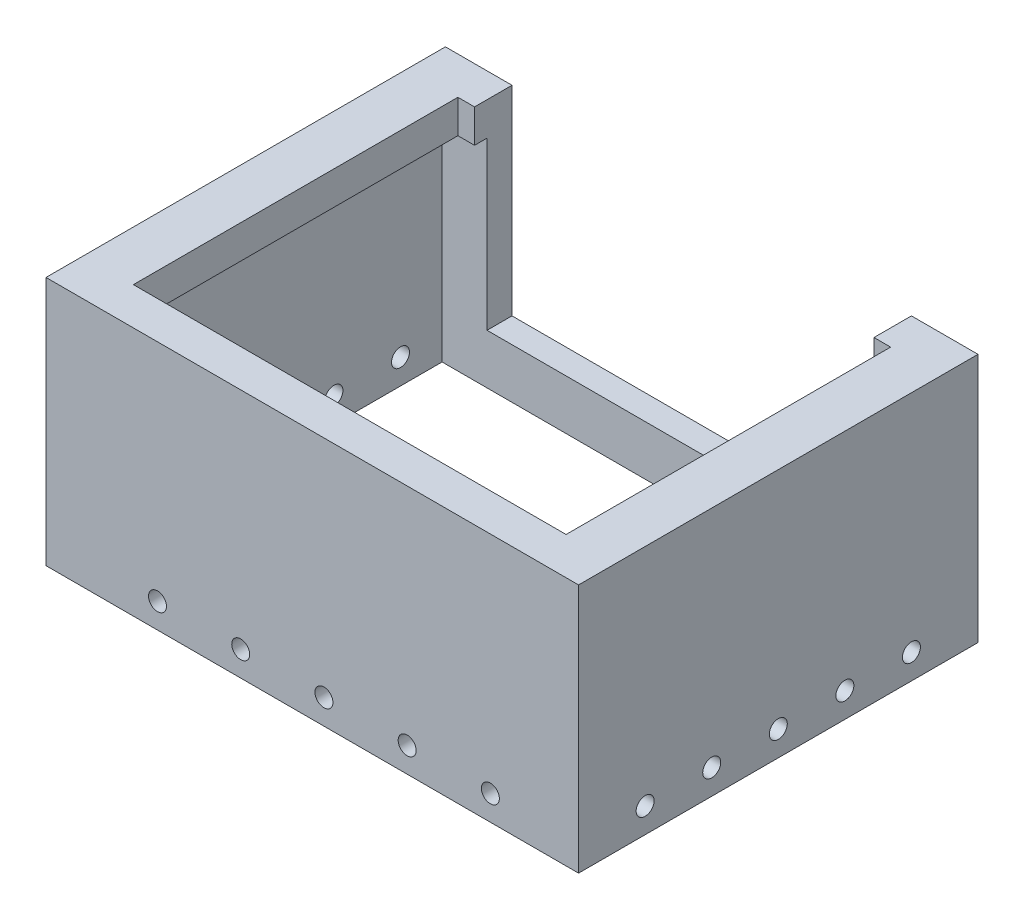
ISO-10303-21;
HEADER;
FILE_DESCRIPTION(('STEP AP214'),'2;1');
FILE_NAME('part.step','',(''),(''),'','','');
FILE_SCHEMA(('AUTOMOTIVE_DESIGN { 1 0 10303 214 1 1 1 1 }'));
ENDSEC;
DATA;
#1=APPLICATION_CONTEXT('core data for automotive mechanical design processes');
#2=APPLICATION_PROTOCOL_DEFINITION('international standard','automotive_design',2000,#1);
#3=PRODUCT_CONTEXT('',#1,'mechanical');
#4=PRODUCT('Part','Part','',(#3));
#5=PRODUCT_RELATED_PRODUCT_CATEGORY('part','',(#4));
#6=PRODUCT_DEFINITION_FORMATION('','',#4);
#7=PRODUCT_DEFINITION_CONTEXT('part definition',#1,'design');
#8=PRODUCT_DEFINITION('design','',#6,#7);
#9=PRODUCT_DEFINITION_SHAPE('','',#8);
#10=(LENGTH_UNIT() NAMED_UNIT(*) SI_UNIT(.MILLI.,.METRE.));
#11=(NAMED_UNIT(*) PLANE_ANGLE_UNIT() SI_UNIT($,.RADIAN.));
#12=(NAMED_UNIT(*) SI_UNIT($,.STERADIAN.) SOLID_ANGLE_UNIT());
#13=UNCERTAINTY_MEASURE_WITH_UNIT(LENGTH_MEASURE(1.E-05),#10,'distance_accuracy_value','');
#14=(GEOMETRIC_REPRESENTATION_CONTEXT(3) GLOBAL_UNCERTAINTY_ASSIGNED_CONTEXT((#13)) GLOBAL_UNIT_ASSIGNED_CONTEXT((#10,
#11,#12)) REPRESENTATION_CONTEXT('',''));
#15=CARTESIAN_POINT('',(0.,0.,0.));
#16=DIRECTION('',(0.,0.,1.));
#17=DIRECTION('',(1.,0.,0.));
#18=AXIS2_PLACEMENT_3D('',#15,#16,#17);
#19=CARTESIAN_POINT('',(-22.4999999999998,10.,-141.171435272045));
#20=DIRECTION('',(1.,0.,0.));
#21=DIRECTION('',(0.,0.,-1.));
#22=AXIS2_PLACEMENT_3D('',#19,#20,#21);
#23=PLANE('',#22);
#24=DIRECTION('',(0.,0.,-1.));
#25=VECTOR('',#24,1.);
#26=CARTESIAN_POINT('',(-22.4999999999998,-50.,-144.921435272045));
#27=LINE('',#26,#25);
#28=CARTESIAN_POINT('',(-22.4999999999998,-50.,-144.921435272045));
#29=VERTEX_POINT('',#28);
#30=CARTESIAN_POINT('',(-22.4999999999998,-50.,-152.421435272045));
#31=VERTEX_POINT('',#30);
#32=EDGE_CURVE('E169',#29,#31,#27,.T.);
#33=ORIENTED_EDGE('',*,*,#32,.F.);
#34=DIRECTION('',(0.,1.,0.));
#35=VECTOR('',#34,1.);
#36=CARTESIAN_POINT('',(-22.4999999999998,-65.,-144.921435272045));
#37=LINE('',#36,#35);
#38=CARTESIAN_POINT('',(-22.4999999999998,0.,-144.921435272045));
#39=VERTEX_POINT('',#38);
#40=EDGE_CURVE('E176',#29,#39,#37,.T.);
#41=ORIENTED_EDGE('',*,*,#40,.T.);
#42=DIRECTION('',(0.,0.,1.));
#43=VECTOR('',#42,1.);
#44=CARTESIAN_POINT('',(-22.4999999999998,0.,-141.171435272045));
#45=LINE('',#44,#43);
#46=CARTESIAN_POINT('',(-22.4999999999998,0.,-141.171435272045));
#47=VERTEX_POINT('',#46);
#48=EDGE_CURVE('E188',#39,#47,#45,.T.);
#49=ORIENTED_EDGE('',*,*,#48,.T.);
#50=DIRECTION('',(0.,-1.,0.));
#51=VECTOR('',#50,1.);
#52=CARTESIAN_POINT('',(-22.4999999999998,10.,-141.171435272045));
#53=LINE('',#52,#51);
#54=CARTESIAN_POINT('',(-22.4999999999998,10.,-141.171435272045));
#55=VERTEX_POINT('',#54);
#56=EDGE_CURVE('E257',#55,#47,#53,.T.);
#57=ORIENTED_EDGE('',*,*,#56,.F.);
#58=DIRECTION('',(0.,0.,1.));
#59=VECTOR('',#58,1.);
#60=CARTESIAN_POINT('',(-22.4999999999998,10.,-141.171435272045));
#61=LINE('',#60,#59);
#62=CARTESIAN_POINT('',(-22.4999999999998,10.,-152.421435272045));
#63=VERTEX_POINT('',#62);
#64=EDGE_CURVE('E200',#63,#55,#61,.T.);
#65=ORIENTED_EDGE('',*,*,#64,.F.);
#66=DIRECTION('',(0.,-1.,0.));
#67=VECTOR('',#66,1.);
#68=CARTESIAN_POINT('',(-22.4999999999998,10.,-152.421435272045));
#69=LINE('',#68,#67);
#70=EDGE_CURVE('E46',#63,#31,#69,.T.);
#71=ORIENTED_EDGE('',*,*,#70,.T.);
#72=EDGE_LOOP('',(#33,#41,#49,#57,#65,#71));
#73=FACE_BOUND('',#72,.T.);
#74=ADVANCED_FACE('F37',(#73),#23,.F.);
#75=CARTESIAN_POINT('',(-142.5,10.,-141.171435272045));
#76=DIRECTION('',(-1.,0.,0.));
#77=DIRECTION('',(0.,0.,1.));
#78=AXIS2_PLACEMENT_3D('',#75,#76,#77);
#79=PLANE('',#78);
#80=DIRECTION('',(0.,0.,1.));
#81=VECTOR('',#80,1.);
#82=CARTESIAN_POINT('',(-142.5,-50.,-141.171435272045));
#83=LINE('',#82,#81);
#84=CARTESIAN_POINT('',(-142.5,-50.,-152.421435272045));
#85=VERTEX_POINT('',#84);
#86=CARTESIAN_POINT('',(-142.5,-50.,-144.921435272045));
#87=VERTEX_POINT('',#86);
#88=EDGE_CURVE('E54',#85,#87,#83,.T.);
#89=ORIENTED_EDGE('',*,*,#88,.F.);
#90=DIRECTION('',(0.,-1.,0.));
#91=VECTOR('',#90,1.);
#92=CARTESIAN_POINT('',(-142.5,10.,-152.421435272045));
#93=LINE('',#92,#91);
#94=CARTESIAN_POINT('',(-142.5,10.,-152.421435272045));
#95=VERTEX_POINT('',#94);
#96=EDGE_CURVE('E240',#95,#85,#93,.T.);
#97=ORIENTED_EDGE('',*,*,#96,.F.);
#98=DIRECTION('',(0.,0.,-1.));
#99=VECTOR('',#98,1.);
#100=CARTESIAN_POINT('',(-142.5,10.,-141.171435272045));
#101=LINE('',#100,#99);
#102=CARTESIAN_POINT('',(-142.5,10.,-141.171435272045));
#103=VERTEX_POINT('',#102);
#104=EDGE_CURVE('E212',#103,#95,#101,.T.);
#105=ORIENTED_EDGE('',*,*,#104,.F.);
#106=DIRECTION('',(0.,-1.,0.));
#107=VECTOR('',#106,1.);
#108=CARTESIAN_POINT('',(-142.5,10.,-141.171435272045));
#109=LINE('',#108,#107);
#110=CARTESIAN_POINT('',(-142.5,0.,-141.171435272045));
#111=VERTEX_POINT('',#110);
#112=EDGE_CURVE('E242',#103,#111,#109,.T.);
#113=ORIENTED_EDGE('',*,*,#112,.T.);
#114=DIRECTION('',(0.,0.,-1.));
#115=VECTOR('',#114,1.);
#116=CARTESIAN_POINT('',(-142.5,0.,-141.171435272045));
#117=LINE('',#116,#115);
#118=CARTESIAN_POINT('',(-142.5,0.,-144.921435272045));
#119=VERTEX_POINT('',#118);
#120=EDGE_CURVE('E198',#111,#119,#117,.T.);
#121=ORIENTED_EDGE('',*,*,#120,.T.);
#122=DIRECTION('',(0.,1.,0.));
#123=VECTOR('',#122,1.);
#124=CARTESIAN_POINT('',(-142.5,-65.,-144.921435272045));
#125=LINE('',#124,#123);
#126=EDGE_CURVE('E186',#87,#119,#125,.T.);
#127=ORIENTED_EDGE('',*,*,#126,.F.);
#128=EDGE_LOOP('',(#89,#97,#105,#113,#121,#127));
#129=FACE_BOUND('',#128,.T.);
#130=ADVANCED_FACE('F335',(#129),#79,.F.);
#131=CARTESIAN_POINT('',(0.,0.,0.));
#132=DIRECTION('',(0.,1.,0.));
#133=DIRECTION('',(0.,0.,1.));
#134=AXIS2_PLACEMENT_3D('',#131,#132,#133);
#135=PLANE('',#134);
#136=DIRECTION('',(-1.,0.,0.));
#137=VECTOR('',#136,1.);
#138=CARTESIAN_POINT('',(-142.5,0.,-144.921435272045));
#139=LINE('',#138,#137);
#140=CARTESIAN_POINT('',(-156.,0.,-144.921435272045));
#141=VERTEX_POINT('',#140);
#142=EDGE_CURVE('E317',#119,#141,#139,.T.);
#143=ORIENTED_EDGE('',*,*,#142,.F.);
#144=ORIENTED_EDGE('',*,*,#120,.F.);
#145=DIRECTION('',(1.,0.,0.));
#146=VECTOR('',#145,1.);
#147=CARTESIAN_POINT('',(-147.5,0.,-141.171435272045));
#148=LINE('',#147,#146);
#149=CARTESIAN_POINT('',(-147.5,0.,-141.171435272045));
#150=VERTEX_POINT('',#149);
#151=EDGE_CURVE('E230',#150,#111,#148,.T.);
#152=ORIENTED_EDGE('',*,*,#151,.F.);
#153=DIRECTION('',(0.,0.,-1.));
#154=VECTOR('',#153,1.);
#155=CARTESIAN_POINT('',(-147.5,0.,-43.671435272045));
#156=LINE('',#155,#154);
#157=CARTESIAN_POINT('',(-147.5,0.,-43.671435272045));
#158=VERTEX_POINT('',#157);
#159=EDGE_CURVE('E228',#158,#150,#156,.T.);
#160=ORIENTED_EDGE('',*,*,#159,.F.);
#161=DIRECTION('',(-1.,0.,0.));
#162=VECTOR('',#161,1.);
#163=CARTESIAN_POINT('',(-17.4999999999999,0.,-43.671435272045));
#164=LINE('',#163,#162);
#165=CARTESIAN_POINT('',(-17.4999999999999,0.,-43.671435272045));
#166=VERTEX_POINT('',#165);
#167=EDGE_CURVE('E226',#166,#158,#164,.T.);
#168=ORIENTED_EDGE('',*,*,#167,.F.);
#169=DIRECTION('',(0.,0.,1.));
#170=VECTOR('',#169,1.);
#171=CARTESIAN_POINT('',(-17.4999999999999,0.,-43.671435272045));
#172=LINE('',#171,#170);
#173=CARTESIAN_POINT('',(-17.4999999999999,0.,-141.171435272045));
#174=VERTEX_POINT('',#173);
#175=EDGE_CURVE('E224',#174,#166,#172,.T.);
#176=ORIENTED_EDGE('',*,*,#175,.F.);
#177=DIRECTION('',(1.,0.,0.));
#178=VECTOR('',#177,1.);
#179=CARTESIAN_POINT('',(-17.4999999999999,0.,-141.171435272045));
#180=LINE('',#179,#178);
#181=EDGE_CURVE('E222',#47,#174,#180,.T.);
#182=ORIENTED_EDGE('',*,*,#181,.F.);
#183=ORIENTED_EDGE('',*,*,#48,.F.);
#184=DIRECTION('',(-1.,0.,0.));
#185=VECTOR('',#184,1.);
#186=CARTESIAN_POINT('',(-22.4999999999998,0.,-144.921435272045));
#187=LINE('',#186,#185);
#188=CARTESIAN_POINT('',(-8.9999999999998,0.,-144.921435272045));
#189=VERTEX_POINT('',#188);
#190=EDGE_CURVE('E184',#189,#39,#187,.T.);
#191=ORIENTED_EDGE('',*,*,#190,.F.);
#192=DIRECTION('',(0.,0.,-1.));
#193=VECTOR('',#192,1.);
#194=CARTESIAN_POINT('',(-8.9999999999998,0.,-144.921435272045));
#195=LINE('',#194,#193);
#196=CARTESIAN_POINT('',(-8.9999999999998,0.,-39.9214352720451));
#197=VERTEX_POINT('',#196);
#198=EDGE_CURVE('E290',#197,#189,#195,.T.);
#199=ORIENTED_EDGE('',*,*,#198,.F.);
#200=DIRECTION('',(1.,0.,0.));
#201=VECTOR('',#200,1.);
#202=CARTESIAN_POINT('',(-156.,0.,-39.9214352720451));
#203=LINE('',#202,#201);
#204=CARTESIAN_POINT('',(-156.,0.,-39.9214352720451));
#205=VERTEX_POINT('',#204);
#206=EDGE_CURVE('E295',#205,#197,#203,.T.);
#207=ORIENTED_EDGE('',*,*,#206,.F.);
#208=DIRECTION('',(0.,0.,1.));
#209=VECTOR('',#208,1.);
#210=CARTESIAN_POINT('',(-156.,0.,-144.921435272045));
#211=LINE('',#210,#209);
#212=EDGE_CURVE('E62',#141,#205,#211,.T.);
#213=ORIENTED_EDGE('',*,*,#212,.F.);
#214=EDGE_LOOP('',(#143,#144,#152,#160,#168,#176,#182,#183,#191,#199,#207,#213));
#215=FACE_BOUND('',#214,.T.);
#216=ADVANCED_FACE('F333',(#215),#135,.F.);
#217=CARTESIAN_POINT('',(-2.49999999999981,10.,-152.421435272045));
#218=DIRECTION('',(-1.,0.,0.));
#219=DIRECTION('',(0.,0.,1.));
#220=AXIS2_PLACEMENT_3D('',#217,#218,#219);
#221=PLANE('',#220);
#222=CARTESIAN_POINT('',(-2.49999999999981,-57.5,-132.421435272045));
#223=DIRECTION('',(-1.,0.,0.));
#224=DIRECTION('',(0.,0.,1.));
#225=AXIS2_PLACEMENT_3D('',#222,#223,#224);
#226=CIRCLE('',#225,2.70000000000001);
#227=CARTESIAN_POINT('',(-2.49999999999981,-57.5,-129.721435272045));
#228=VERTEX_POINT('',#227);
#229=EDGE_CURVE('E265',#228,#228,#226,.T.);
#230=ORIENTED_EDGE('',*,*,#229,.T.);
#231=EDGE_LOOP('',(#230));
#232=FACE_BOUND('',#231,.T.);
#233=CARTESIAN_POINT('',(-2.49999999999981,-57.5,-112.421435272045));
#234=DIRECTION('',(-1.,0.,0.));
#235=DIRECTION('',(0.,0.,1.));
#236=AXIS2_PLACEMENT_3D('',#233,#234,#235);
#237=CIRCLE('',#236,2.7);
#238=CARTESIAN_POINT('',(-2.49999999999981,-57.5,-109.721435272045));
#239=VERTEX_POINT('',#238);
#240=EDGE_CURVE('E408',#239,#239,#237,.T.);
#241=ORIENTED_EDGE('',*,*,#240,.T.);
#242=EDGE_LOOP('',(#241));
#243=FACE_BOUND('',#242,.T.);
#244=CARTESIAN_POINT('',(-2.49999999999981,-57.5,-92.4214352720452));
#245=DIRECTION('',(-1.,0.,0.));
#246=DIRECTION('',(0.,0.,1.));
#247=AXIS2_PLACEMENT_3D('',#244,#245,#246);
#248=CIRCLE('',#247,2.7);
#249=CARTESIAN_POINT('',(-2.49999999999981,-57.5,-89.7214352720452));
#250=VERTEX_POINT('',#249);
#251=EDGE_CURVE('E414',#250,#250,#248,.T.);
#252=ORIENTED_EDGE('',*,*,#251,.T.);
#253=EDGE_LOOP('',(#252));
#254=FACE_BOUND('',#253,.T.);
#255=CARTESIAN_POINT('',(-2.49999999999981,-57.5,-72.4214352720452));
#256=DIRECTION('',(-1.,0.,0.));
#257=DIRECTION('',(0.,0.,1.));
#258=AXIS2_PLACEMENT_3D('',#255,#256,#257);
#259=CIRCLE('',#258,2.7);
#260=CARTESIAN_POINT('',(-2.49999999999981,-57.5,-69.7214352720452));
#261=VERTEX_POINT('',#260);
#262=EDGE_CURVE('E420',#261,#261,#259,.T.);
#263=ORIENTED_EDGE('',*,*,#262,.T.);
#264=EDGE_LOOP('',(#263));
#265=FACE_BOUND('',#264,.T.);
#266=CARTESIAN_POINT('',(-2.49999999999978,-57.5,-52.4214352720452));
#267=DIRECTION('',(-1.,0.,0.));
#268=DIRECTION('',(0.,0.,1.));
#269=AXIS2_PLACEMENT_3D('',#266,#267,#268);
#270=CIRCLE('',#269,2.7);
#271=CARTESIAN_POINT('',(-2.49999999999978,-57.5,-49.7214352720452));
#272=VERTEX_POINT('',#271);
#273=EDGE_CURVE('E426',#272,#272,#270,.T.);
#274=ORIENTED_EDGE('',*,*,#273,.T.);
#275=EDGE_LOOP('',(#274));
#276=FACE_BOUND('',#275,.T.);
#277=DIRECTION('',(0.,-1.,0.));
#278=VECTOR('',#277,1.);
#279=CARTESIAN_POINT('',(-2.49999999999983,10.,-32.421435272045));
#280=LINE('',#279,#278);
#281=CARTESIAN_POINT('',(-2.49999999999983,10.,-32.421435272045));
#282=VERTEX_POINT('',#281);
#283=CARTESIAN_POINT('',(-2.49999999999983,-65.,-32.421435272045));
#284=VERTEX_POINT('',#283);
#285=EDGE_CURVE('E220',#282,#284,#280,.T.);
#286=ORIENTED_EDGE('',*,*,#285,.T.);
#287=DIRECTION('',(0.,0.,1.));
#288=VECTOR('',#287,1.);
#289=CARTESIAN_POINT('',(-2.49999999999983,-65.,-152.421435272045));
#290=LINE('',#289,#288);
#291=CARTESIAN_POINT('',(-2.49999999999983,-65.,-152.421435272045));
#292=VERTEX_POINT('',#291);
#293=EDGE_CURVE('E300',#292,#284,#290,.T.);
#294=ORIENTED_EDGE('',*,*,#293,.F.);
#295=DIRECTION('',(0.,-1.,0.));
#296=VECTOR('',#295,1.);
#297=CARTESIAN_POINT('',(-2.49999999999981,10.,-152.421435272045));
#298=LINE('',#297,#296);
#299=CARTESIAN_POINT('',(-2.49999999999981,10.,-152.421435272045));
#300=VERTEX_POINT('',#299);
#301=EDGE_CURVE('E11',#300,#292,#298,.T.);
#302=ORIENTED_EDGE('',*,*,#301,.F.);
#303=DIRECTION('',(0.,0.,-1.));
#304=VECTOR('',#303,1.);
#305=CARTESIAN_POINT('',(-2.49999999999981,10.,-152.421435272045));
#306=LINE('',#305,#304);
#307=EDGE_CURVE('E194',#282,#300,#306,.T.);
#308=ORIENTED_EDGE('',*,*,#307,.F.);
#309=EDGE_LOOP('',(#286,#294,#302,#308));
#310=FACE_BOUND('',#309,.T.);
#311=ADVANCED_FACE('F39',(#232,#243,#254,#265,#276,#310),#221,.F.);
#312=CARTESIAN_POINT('',(-17.4999999999999,10.,-141.171435272045));
#313=DIRECTION('',(0.,0.,-1.));
#314=DIRECTION('',(-1.,0.,0.));
#315=AXIS2_PLACEMENT_3D('',#312,#313,#314);
#316=PLANE('',#315);
#317=ORIENTED_EDGE('',*,*,#181,.T.);
#318=DIRECTION('',(0.,-1.,0.));
#319=VECTOR('',#318,1.);
#320=CARTESIAN_POINT('',(-17.4999999999999,10.,-141.171435272045));
#321=LINE('',#320,#319);
#322=CARTESIAN_POINT('',(-17.4999999999999,10.,-141.171435272045));
#323=VERTEX_POINT('',#322);
#324=EDGE_CURVE('E254',#323,#174,#321,.T.);
#325=ORIENTED_EDGE('',*,*,#324,.F.);
#326=DIRECTION('',(1.,0.,0.));
#327=VECTOR('',#326,1.);
#328=CARTESIAN_POINT('',(-17.4999999999999,10.,-141.171435272045));
#329=LINE('',#328,#327);
#330=EDGE_CURVE('E202',#55,#323,#329,.T.);
#331=ORIENTED_EDGE('',*,*,#330,.F.);
#332=ORIENTED_EDGE('',*,*,#56,.T.);
#333=EDGE_LOOP('',(#317,#325,#331,#332));
#334=FACE_BOUND('',#333,.T.);
#335=ADVANCED_FACE('F359',(#334),#316,.F.);
#336=CARTESIAN_POINT('',(-17.4999999999999,10.,-43.671435272045));
#337=DIRECTION('',(1.,0.,0.));
#338=DIRECTION('',(0.,0.,-1.));
#339=AXIS2_PLACEMENT_3D('',#336,#337,#338);
#340=PLANE('',#339);
#341=ORIENTED_EDGE('',*,*,#175,.T.);
#342=DIRECTION('',(0.,-1.,0.));
#343=VECTOR('',#342,1.);
#344=CARTESIAN_POINT('',(-17.4999999999999,10.,-43.671435272045));
#345=LINE('',#344,#343);
#346=CARTESIAN_POINT('',(-17.4999999999999,10.,-43.671435272045));
#347=VERTEX_POINT('',#346);
#348=EDGE_CURVE('E251',#347,#166,#345,.T.);
#349=ORIENTED_EDGE('',*,*,#348,.F.);
#350=DIRECTION('',(0.,0.,1.));
#351=VECTOR('',#350,1.);
#352=CARTESIAN_POINT('',(-17.4999999999999,10.,-43.671435272045));
#353=LINE('',#352,#351);
#354=EDGE_CURVE('E204',#323,#347,#353,.T.);
#355=ORIENTED_EDGE('',*,*,#354,.F.);
#356=ORIENTED_EDGE('',*,*,#324,.T.);
#357=EDGE_LOOP('',(#341,#349,#355,#356));
#358=FACE_BOUND('',#357,.T.);
#359=ADVANCED_FACE('F355',(#358),#340,.F.);
#360=CARTESIAN_POINT('',(-17.4999999999999,10.,-43.671435272045));
#361=DIRECTION('',(0.,0.,1.));
#362=DIRECTION('',(1.,0.,0.));
#363=AXIS2_PLACEMENT_3D('',#360,#361,#362);
#364=PLANE('',#363);
#365=ORIENTED_EDGE('',*,*,#167,.T.);
#366=DIRECTION('',(0.,-1.,0.));
#367=VECTOR('',#366,1.);
#368=CARTESIAN_POINT('',(-147.5,10.,-43.671435272045));
#369=LINE('',#368,#367);
#370=CARTESIAN_POINT('',(-147.5,10.,-43.671435272045));
#371=VERTEX_POINT('',#370);
#372=EDGE_CURVE('E248',#371,#158,#369,.T.);
#373=ORIENTED_EDGE('',*,*,#372,.F.);
#374=DIRECTION('',(-1.,0.,0.));
#375=VECTOR('',#374,1.);
#376=CARTESIAN_POINT('',(-17.4999999999999,10.,-43.671435272045));
#377=LINE('',#376,#375);
#378=EDGE_CURVE('E206',#347,#371,#377,.T.);
#379=ORIENTED_EDGE('',*,*,#378,.F.);
#380=ORIENTED_EDGE('',*,*,#348,.T.);
#381=EDGE_LOOP('',(#365,#373,#379,#380));
#382=FACE_BOUND('',#381,.T.);
#383=ADVANCED_FACE('F351',(#382),#364,.F.);
#384=CARTESIAN_POINT('',(-147.5,10.,-43.671435272045));
#385=DIRECTION('',(-1.,0.,0.));
#386=DIRECTION('',(0.,0.,1.));
#387=AXIS2_PLACEMENT_3D('',#384,#385,#386);
#388=PLANE('',#387);
#389=ORIENTED_EDGE('',*,*,#159,.T.);
#390=DIRECTION('',(0.,-1.,0.));
#391=VECTOR('',#390,1.);
#392=CARTESIAN_POINT('',(-147.5,10.,-141.171435272045));
#393=LINE('',#392,#391);
#394=CARTESIAN_POINT('',(-147.5,10.,-141.171435272045));
#395=VERTEX_POINT('',#394);
#396=EDGE_CURVE('E245',#395,#150,#393,.T.);
#397=ORIENTED_EDGE('',*,*,#396,.F.);
#398=DIRECTION('',(0.,0.,-1.));
#399=VECTOR('',#398,1.);
#400=CARTESIAN_POINT('',(-147.5,10.,-43.671435272045));
#401=LINE('',#400,#399);
#402=EDGE_CURVE('E208',#371,#395,#401,.T.);
#403=ORIENTED_EDGE('',*,*,#402,.F.);
#404=ORIENTED_EDGE('',*,*,#372,.T.);
#405=EDGE_LOOP('',(#389,#397,#403,#404));
#406=FACE_BOUND('',#405,.T.);
#407=ADVANCED_FACE('F346',(#406),#388,.F.);
#408=CARTESIAN_POINT('',(-147.5,10.,-141.171435272045));
#409=DIRECTION('',(0.,0.,-1.));
#410=DIRECTION('',(-1.,0.,0.));
#411=AXIS2_PLACEMENT_3D('',#408,#409,#410);
#412=PLANE('',#411);
#413=ORIENTED_EDGE('',*,*,#151,.T.);
#414=ORIENTED_EDGE('',*,*,#112,.F.);
#415=DIRECTION('',(1.,0.,0.));
#416=VECTOR('',#415,1.);
#417=CARTESIAN_POINT('',(-147.5,10.,-141.171435272045));
#418=LINE('',#417,#416);
#419=EDGE_CURVE('E210',#395,#103,#418,.T.);
#420=ORIENTED_EDGE('',*,*,#419,.F.);
#421=ORIENTED_EDGE('',*,*,#396,.T.);
#422=EDGE_LOOP('',(#413,#414,#420,#421));
#423=FACE_BOUND('',#422,.T.);
#424=ADVANCED_FACE('F340',(#423),#412,.F.);
#425=CARTESIAN_POINT('',(-162.5,10.,-152.421435272045));
#426=DIRECTION('',(0.,0.,1.));
#427=DIRECTION('',(1.,0.,0.));
#428=AXIS2_PLACEMENT_3D('',#425,#426,#427);
#429=PLANE('',#428);
#430=ORIENTED_EDGE('',*,*,#96,.T.);
#431=DIRECTION('',(1.,0.,0.));
#432=VECTOR('',#431,1.);
#433=CARTESIAN_POINT('',(-143.5,-50.,-152.421435272045));
#434=LINE('',#433,#432);
#435=EDGE_CURVE('E173',#85,#31,#434,.T.);
#436=ORIENTED_EDGE('',*,*,#435,.T.);
#437=ORIENTED_EDGE('',*,*,#70,.F.);
#438=DIRECTION('',(-1.,0.,0.));
#439=VECTOR('',#438,1.);
#440=CARTESIAN_POINT('',(-2.49999999999981,10.,-152.421435272045));
#441=LINE('',#440,#439);
#442=EDGE_CURVE('E197',#300,#63,#441,.T.);
#443=ORIENTED_EDGE('',*,*,#442,.F.);
#444=ORIENTED_EDGE('',*,*,#301,.T.);
#445=DIRECTION('',(1.,0.,0.));
#446=VECTOR('',#445,1.);
#447=CARTESIAN_POINT('',(-2.49999999999983,-65.,-152.421435272045));
#448=LINE('',#447,#446);
#449=CARTESIAN_POINT('',(-162.5,-65.,-152.421435272045));
#450=VERTEX_POINT('',#449);
#451=EDGE_CURVE('E297',#450,#292,#448,.T.);
#452=ORIENTED_EDGE('',*,*,#451,.F.);
#453=DIRECTION('',(0.,-1.,0.));
#454=VECTOR('',#453,1.);
#455=CARTESIAN_POINT('',(-162.5,10.,-152.421435272045));
#456=LINE('',#455,#454);
#457=CARTESIAN_POINT('',(-162.5,10.,-152.421435272045));
#458=VERTEX_POINT('',#457);
#459=EDGE_CURVE('E237',#458,#450,#456,.T.);
#460=ORIENTED_EDGE('',*,*,#459,.F.);
#461=DIRECTION('',(-1.,0.,0.));
#462=VECTOR('',#461,1.);
#463=CARTESIAN_POINT('',(-162.5,10.,-152.421435272045));
#464=LINE('',#463,#462);
#465=EDGE_CURVE('E214',#95,#458,#464,.T.);
#466=ORIENTED_EDGE('',*,*,#465,.F.);
#467=EDGE_LOOP('',(#430,#436,#437,#443,#444,#452,#460,#466));
#468=FACE_BOUND('',#467,.T.);
#469=ADVANCED_FACE('F367',(#468),#429,.F.);
#470=CARTESIAN_POINT('',(-162.5,10.,-152.421435272045));
#471=DIRECTION('',(1.,0.,0.));
#472=DIRECTION('',(0.,0.,-1.));
#473=AXIS2_PLACEMENT_3D('',#470,#471,#472);
#474=PLANE('',#473);
#475=CARTESIAN_POINT('',(-162.5,-57.5,-132.421435272045));
#476=DIRECTION('',(-1.,0.,0.));
#477=DIRECTION('',(0.,0.,1.));
#478=AXIS2_PLACEMENT_3D('',#475,#476,#477);
#479=CIRCLE('',#478,2.70000000000001);
#480=CARTESIAN_POINT('',(-162.5,-57.5,-129.721435272045));
#481=VERTEX_POINT('',#480);
#482=EDGE_CURVE('E405',#481,#481,#479,.T.);
#483=ORIENTED_EDGE('',*,*,#482,.F.);
#484=EDGE_LOOP('',(#483));
#485=FACE_BOUND('',#484,.T.);
#486=CARTESIAN_POINT('',(-162.5,-57.5,-112.421435272045));
#487=DIRECTION('',(-1.,0.,0.));
#488=DIRECTION('',(0.,0.,1.));
#489=AXIS2_PLACEMENT_3D('',#486,#487,#488);
#490=CIRCLE('',#489,2.7);
#491=CARTESIAN_POINT('',(-162.5,-57.5,-109.721435272045));
#492=VERTEX_POINT('',#491);
#493=EDGE_CURVE('E411',#492,#492,#490,.T.);
#494=ORIENTED_EDGE('',*,*,#493,.F.);
#495=EDGE_LOOP('',(#494));
#496=FACE_BOUND('',#495,.T.);
#497=CARTESIAN_POINT('',(-162.5,-57.5,-92.4214352720452));
#498=DIRECTION('',(-1.,0.,0.));
#499=DIRECTION('',(0.,0.,1.));
#500=AXIS2_PLACEMENT_3D('',#497,#498,#499);
#501=CIRCLE('',#500,2.7);
#502=CARTESIAN_POINT('',(-162.5,-57.5,-89.7214352720452));
#503=VERTEX_POINT('',#502);
#504=EDGE_CURVE('E417',#503,#503,#501,.T.);
#505=ORIENTED_EDGE('',*,*,#504,.F.);
#506=EDGE_LOOP('',(#505));
#507=FACE_BOUND('',#506,.T.);
#508=CARTESIAN_POINT('',(-162.5,-57.5,-72.4214352720452));
#509=DIRECTION('',(-1.,0.,0.));
#510=DIRECTION('',(0.,0.,1.));
#511=AXIS2_PLACEMENT_3D('',#508,#509,#510);
#512=CIRCLE('',#511,2.7);
#513=CARTESIAN_POINT('',(-162.5,-57.5,-69.7214352720452));
#514=VERTEX_POINT('',#513);
#515=EDGE_CURVE('E423',#514,#514,#512,.T.);
#516=ORIENTED_EDGE('',*,*,#515,.F.);
#517=EDGE_LOOP('',(#516));
#518=FACE_BOUND('',#517,.T.);
#519=CARTESIAN_POINT('',(-162.5,-57.5,-52.4214352720452));
#520=DIRECTION('',(-1.,0.,0.));
#521=DIRECTION('',(0.,0.,1.));
#522=AXIS2_PLACEMENT_3D('',#519,#520,#521);
#523=CIRCLE('',#522,2.7);
#524=CARTESIAN_POINT('',(-162.5,-57.5,-49.7214352720452));
#525=VERTEX_POINT('',#524);
#526=EDGE_CURVE('E402',#525,#525,#523,.T.);
#527=ORIENTED_EDGE('',*,*,#526,.F.);
#528=EDGE_LOOP('',(#527));
#529=FACE_BOUND('',#528,.T.);
#530=ORIENTED_EDGE('',*,*,#459,.T.);
#531=DIRECTION('',(0.,0.,-1.));
#532=VECTOR('',#531,1.);
#533=CARTESIAN_POINT('',(-162.5,-65.,-152.421435272045));
#534=LINE('',#533,#532);
#535=CARTESIAN_POINT('',(-162.5,-65.,-32.421435272045));
#536=VERTEX_POINT('',#535);
#537=EDGE_CURVE('E306',#536,#450,#534,.T.);
#538=ORIENTED_EDGE('',*,*,#537,.F.);
#539=DIRECTION('',(0.,-1.,0.));
#540=VECTOR('',#539,1.);
#541=CARTESIAN_POINT('',(-162.5,10.,-32.421435272045));
#542=LINE('',#541,#540);
#543=CARTESIAN_POINT('',(-162.5,10.,-32.421435272045));
#544=VERTEX_POINT('',#543);
#545=EDGE_CURVE('E235',#544,#536,#542,.T.);
#546=ORIENTED_EDGE('',*,*,#545,.F.);
#547=DIRECTION('',(0.,0.,1.));
#548=VECTOR('',#547,1.);
#549=CARTESIAN_POINT('',(-162.5,10.,-152.421435272045));
#550=LINE('',#549,#548);
#551=EDGE_CURVE('E216',#458,#544,#550,.T.);
#552=ORIENTED_EDGE('',*,*,#551,.F.);
#553=EDGE_LOOP('',(#530,#538,#546,#552));
#554=FACE_BOUND('',#553,.T.);
#555=ADVANCED_FACE('F478',(#485,#496,#507,#518,#529,#554),#474,.F.);
#556=CARTESIAN_POINT('',(-162.5,10.,-32.421435272045));
#557=DIRECTION('',(0.,0.,-1.));
#558=DIRECTION('',(-1.,0.,0.));
#559=AXIS2_PLACEMENT_3D('',#556,#557,#558);
#560=PLANE('',#559);
#561=CARTESIAN_POINT('',(-28.9999999999998,-57.5,-32.421435272045));
#562=DIRECTION('',(0.,0.,-1.));
#563=DIRECTION('',(-1.,0.,0.));
#564=AXIS2_PLACEMENT_3D('',#561,#562,#563);
#565=CIRCLE('',#564,2.7);
#566=CARTESIAN_POINT('',(-31.6999999999998,-57.5,-32.421435272045));
#567=VERTEX_POINT('',#566);
#568=EDGE_CURVE('E399',#567,#567,#565,.T.);
#569=ORIENTED_EDGE('',*,*,#568,.T.);
#570=EDGE_LOOP('',(#569));
#571=FACE_BOUND('',#570,.T.);
#572=CARTESIAN_POINT('',(-53.9999999999998,-57.5,-32.421435272045));
#573=DIRECTION('',(0.,0.,-1.));
#574=DIRECTION('',(-1.,0.,0.));
#575=AXIS2_PLACEMENT_3D('',#572,#573,#574);
#576=CIRCLE('',#575,2.7);
#577=CARTESIAN_POINT('',(-56.6999999999998,-57.5,-32.421435272045));
#578=VERTEX_POINT('',#577);
#579=EDGE_CURVE('E396',#578,#578,#576,.T.);
#580=ORIENTED_EDGE('',*,*,#579,.T.);
#581=EDGE_LOOP('',(#580));
#582=FACE_BOUND('',#581,.T.);
#583=CARTESIAN_POINT('',(-78.9999999999998,-57.5,-32.421435272045));
#584=DIRECTION('',(0.,0.,-1.));
#585=DIRECTION('',(-1.,0.,0.));
#586=AXIS2_PLACEMENT_3D('',#583,#584,#585);
#587=CIRCLE('',#586,2.7);
#588=CARTESIAN_POINT('',(-81.6999999999998,-57.5,-32.421435272045));
#589=VERTEX_POINT('',#588);
#590=EDGE_CURVE('E393',#589,#589,#587,.T.);
#591=ORIENTED_EDGE('',*,*,#590,.T.);
#592=EDGE_LOOP('',(#591));
#593=FACE_BOUND('',#592,.T.);
#594=CARTESIAN_POINT('',(-104.,-57.5,-32.421435272045));
#595=DIRECTION('',(0.,0.,-1.));
#596=DIRECTION('',(-1.,0.,0.));
#597=AXIS2_PLACEMENT_3D('',#594,#595,#596);
#598=CIRCLE('',#597,2.7);
#599=CARTESIAN_POINT('',(-106.7,-57.5,-32.421435272045));
#600=VERTEX_POINT('',#599);
#601=EDGE_CURVE('E390',#600,#600,#598,.T.);
#602=ORIENTED_EDGE('',*,*,#601,.T.);
#603=EDGE_LOOP('',(#602));
#604=FACE_BOUND('',#603,.T.);
#605=CARTESIAN_POINT('',(-129.,-57.5,-32.421435272045));
#606=DIRECTION('',(0.,0.,-1.));
#607=DIRECTION('',(-1.,0.,0.));
#608=AXIS2_PLACEMENT_3D('',#605,#606,#607);
#609=CIRCLE('',#608,2.70000000000001);
#610=CARTESIAN_POINT('',(-131.7,-57.5,-32.421435272045));
#611=VERTEX_POINT('',#610);
#612=EDGE_CURVE('E376',#611,#611,#609,.T.);
#613=ORIENTED_EDGE('',*,*,#612,.T.);
#614=EDGE_LOOP('',(#613));
#615=FACE_BOUND('',#614,.T.);
#616=ORIENTED_EDGE('',*,*,#545,.T.);
#617=DIRECTION('',(-1.,0.,0.));
#618=VECTOR('',#617,1.);
#619=CARTESIAN_POINT('',(-162.5,-65.,-32.421435272045));
#620=LINE('',#619,#618);
#621=EDGE_CURVE('E303',#284,#536,#620,.T.);
#622=ORIENTED_EDGE('',*,*,#621,.F.);
#623=ORIENTED_EDGE('',*,*,#285,.F.);
#624=DIRECTION('',(1.,0.,0.));
#625=VECTOR('',#624,1.);
#626=CARTESIAN_POINT('',(-162.5,10.,-32.421435272045));
#627=LINE('',#626,#625);
#628=EDGE_CURVE('E218',#544,#282,#627,.T.);
#629=ORIENTED_EDGE('',*,*,#628,.F.);
#630=EDGE_LOOP('',(#616,#622,#623,#629));
#631=FACE_BOUND('',#630,.T.);
#632=ADVANCED_FACE('F481',(#571,#582,#593,#604,#615,#631),#560,.F.);
#633=CARTESIAN_POINT('',(0.,10.,0.));
#634=DIRECTION('',(0.,1.,0.));
#635=DIRECTION('',(0.,0.,1.));
#636=AXIS2_PLACEMENT_3D('',#633,#634,#635);
#637=PLANE('',#636);
#638=ORIENTED_EDGE('',*,*,#307,.T.);
#639=ORIENTED_EDGE('',*,*,#442,.T.);
#640=ORIENTED_EDGE('',*,*,#64,.T.);
#641=ORIENTED_EDGE('',*,*,#330,.T.);
#642=ORIENTED_EDGE('',*,*,#354,.T.);
#643=ORIENTED_EDGE('',*,*,#378,.T.);
#644=ORIENTED_EDGE('',*,*,#402,.T.);
#645=ORIENTED_EDGE('',*,*,#419,.T.);
#646=ORIENTED_EDGE('',*,*,#104,.T.);
#647=ORIENTED_EDGE('',*,*,#465,.T.);
#648=ORIENTED_EDGE('',*,*,#551,.T.);
#649=ORIENTED_EDGE('',*,*,#628,.T.);
#650=EDGE_LOOP('',(#638,#639,#640,#641,#642,#643,#644,#645,#646,#647,#648,#649));
#651=FACE_BOUND('',#650,.T.);
#652=ADVANCED_FACE('F363',(#651),#637,.T.);
#653=CARTESIAN_POINT('',(-8.9999999999998,-65.,-144.921435272045));
#654=DIRECTION('',(1.,0.,0.));
#655=DIRECTION('',(0.,0.,-1.));
#656=AXIS2_PLACEMENT_3D('',#653,#654,#655);
#657=PLANE('',#656);
#658=CARTESIAN_POINT('',(-8.9999999999998,-57.5,-132.421435272045));
#659=DIRECTION('',(1.,0.,0.));
#660=DIRECTION('',(0.,0.,-1.));
#661=AXIS2_PLACEMENT_3D('',#658,#659,#660);
#662=CIRCLE('',#661,2.70000000000001);
#663=CARTESIAN_POINT('',(-8.9999999999998,-57.5,-135.121435272045));
#664=VERTEX_POINT('',#663);
#665=EDGE_CURVE('E287',#664,#664,#662,.T.);
#666=ORIENTED_EDGE('',*,*,#665,.T.);
#667=EDGE_LOOP('',(#666));
#668=FACE_BOUND('',#667,.T.);
#669=CARTESIAN_POINT('',(-8.9999999999998,-57.5,-112.421435272045));
#670=DIRECTION('',(1.,0.,0.));
#671=DIRECTION('',(0.,0.,-1.));
#672=AXIS2_PLACEMENT_3D('',#669,#670,#671);
#673=CIRCLE('',#672,2.7);
#674=CARTESIAN_POINT('',(-8.9999999999998,-57.5,-115.121435272045));
#675=VERTEX_POINT('',#674);
#676=EDGE_CURVE('E275',#675,#675,#673,.T.);
#677=ORIENTED_EDGE('',*,*,#676,.T.);
#678=EDGE_LOOP('',(#677));
#679=FACE_BOUND('',#678,.T.);
#680=CARTESIAN_POINT('',(-8.9999999999998,-57.5,-92.4214352720452));
#681=DIRECTION('',(1.,0.,0.));
#682=DIRECTION('',(0.,0.,-1.));
#683=AXIS2_PLACEMENT_3D('',#680,#681,#682);
#684=CIRCLE('',#683,2.7);
#685=CARTESIAN_POINT('',(-8.9999999999998,-57.5,-95.1214352720452));
#686=VERTEX_POINT('',#685);
#687=EDGE_CURVE('E272',#686,#686,#684,.T.);
#688=ORIENTED_EDGE('',*,*,#687,.T.);
#689=EDGE_LOOP('',(#688));
#690=FACE_BOUND('',#689,.T.);
#691=CARTESIAN_POINT('',(-8.9999999999998,-57.5,-72.4214352720452));
#692=DIRECTION('',(1.,0.,0.));
#693=DIRECTION('',(0.,0.,-1.));
#694=AXIS2_PLACEMENT_3D('',#691,#692,#693);
#695=CIRCLE('',#694,2.7);
#696=CARTESIAN_POINT('',(-8.9999999999998,-57.5,-75.1214352720452));
#697=VERTEX_POINT('',#696);
#698=EDGE_CURVE('E269',#697,#697,#695,.T.);
#699=ORIENTED_EDGE('',*,*,#698,.T.);
#700=EDGE_LOOP('',(#699));
#701=FACE_BOUND('',#700,.T.);
#702=CARTESIAN_POINT('',(-8.9999999999998,-57.5,-52.4214352720452));
#703=DIRECTION('',(1.,0.,0.));
#704=DIRECTION('',(0.,0.,-1.));
#705=AXIS2_PLACEMENT_3D('',#702,#703,#704);
#706=CIRCLE('',#705,2.7);
#707=CARTESIAN_POINT('',(-8.9999999999998,-57.5,-55.1214352720452));
#708=VERTEX_POINT('',#707);
#709=EDGE_CURVE('E264',#708,#708,#706,.T.);
#710=ORIENTED_EDGE('',*,*,#709,.T.);
#711=EDGE_LOOP('',(#710));
#712=FACE_BOUND('',#711,.T.);
#713=ORIENTED_EDGE('',*,*,#198,.T.);
#714=DIRECTION('',(0.,1.,0.));
#715=VECTOR('',#714,1.);
#716=CARTESIAN_POINT('',(-8.9999999999998,-65.,-144.921435272045));
#717=LINE('',#716,#715);
#718=CARTESIAN_POINT('',(-8.9999999999998,-65.,-144.921435272045));
#719=VERTEX_POINT('',#718);
#720=EDGE_CURVE('E185',#719,#189,#717,.T.);
#721=ORIENTED_EDGE('',*,*,#720,.F.);
#722=DIRECTION('',(0.,0.,-1.));
#723=VECTOR('',#722,1.);
#724=CARTESIAN_POINT('',(-8.9999999999998,-65.,-144.921435272045));
#725=LINE('',#724,#723);
#726=CARTESIAN_POINT('',(-8.9999999999998,-65.,-39.9214352720451));
#727=VERTEX_POINT('',#726);
#728=EDGE_CURVE('E291',#727,#719,#725,.T.);
#729=ORIENTED_EDGE('',*,*,#728,.F.);
#730=DIRECTION('',(0.,1.,0.));
#731=VECTOR('',#730,1.);
#732=CARTESIAN_POINT('',(-8.9999999999998,-65.,-39.9214352720451));
#733=LINE('',#732,#731);
#734=EDGE_CURVE('E313',#727,#197,#733,.T.);
#735=ORIENTED_EDGE('',*,*,#734,.T.);
#736=EDGE_LOOP('',(#713,#721,#729,#735));
#737=FACE_BOUND('',#736,.T.);
#738=ADVANCED_FACE('F433',(#668,#679,#690,#701,#712,#737),#657,.F.);
#739=CARTESIAN_POINT('',(-22.4999999999998,-65.,-144.921435272045));
#740=DIRECTION('',(0.,0.,-1.));
#741=DIRECTION('',(-1.,0.,0.));
#742=AXIS2_PLACEMENT_3D('',#739,#740,#741);
#743=PLANE('',#742);
#744=ORIENTED_EDGE('',*,*,#190,.T.);
#745=ORIENTED_EDGE('',*,*,#40,.F.);
#746=DIRECTION('',(1.,0.,0.));
#747=VECTOR('',#746,1.);
#748=CARTESIAN_POINT('',(-143.5,-50.,-144.921435272045));
#749=LINE('',#748,#747);
#750=EDGE_CURVE('E165',#87,#29,#749,.T.);
#751=ORIENTED_EDGE('',*,*,#750,.F.);
#752=ORIENTED_EDGE('',*,*,#126,.T.);
#753=ORIENTED_EDGE('',*,*,#142,.T.);
#754=DIRECTION('',(0.,1.,0.));
#755=VECTOR('',#754,1.);
#756=CARTESIAN_POINT('',(-156.,-65.,-144.921435272045));
#757=LINE('',#756,#755);
#758=CARTESIAN_POINT('',(-156.,-65.,-144.921435272045));
#759=VERTEX_POINT('',#758);
#760=EDGE_CURVE('E190',#759,#141,#757,.T.);
#761=ORIENTED_EDGE('',*,*,#760,.F.);
#762=DIRECTION('',(-1.,0.,0.));
#763=VECTOR('',#762,1.);
#764=CARTESIAN_POINT('',(-22.4999999999998,-65.,-144.921435272045));
#765=LINE('',#764,#763);
#766=EDGE_CURVE('E294',#719,#759,#765,.T.);
#767=ORIENTED_EDGE('',*,*,#766,.F.);
#768=ORIENTED_EDGE('',*,*,#720,.T.);
#769=EDGE_LOOP('',(#744,#745,#751,#752,#753,#761,#767,#768));
#770=FACE_BOUND('',#769,.T.);
#771=ADVANCED_FACE('F182',(#770),#743,.F.);
#772=CARTESIAN_POINT('',(-156.,-65.,-144.921435272045));
#773=DIRECTION('',(-1.,0.,0.));
#774=DIRECTION('',(0.,0.,1.));
#775=AXIS2_PLACEMENT_3D('',#772,#773,#774);
#776=PLANE('',#775);
#777=CARTESIAN_POINT('',(-156.,-57.5,-132.421435272045));
#778=DIRECTION('',(-1.,0.,0.));
#779=DIRECTION('',(0.,0.,1.));
#780=AXIS2_PLACEMENT_3D('',#777,#778,#779);
#781=CIRCLE('',#780,2.70000000000001);
#782=CARTESIAN_POINT('',(-156.,-57.5,-129.721435272045));
#783=VERTEX_POINT('',#782);
#784=EDGE_CURVE('E41',#783,#783,#781,.T.);
#785=ORIENTED_EDGE('',*,*,#784,.T.);
#786=EDGE_LOOP('',(#785));
#787=FACE_BOUND('',#786,.T.);
#788=CARTESIAN_POINT('',(-156.,-57.5,-112.421435272045));
#789=DIRECTION('',(-1.,0.,0.));
#790=DIRECTION('',(0.,0.,1.));
#791=AXIS2_PLACEMENT_3D('',#788,#789,#790);
#792=CIRCLE('',#791,2.7);
#793=CARTESIAN_POINT('',(-156.,-57.5,-109.721435272045));
#794=VERTEX_POINT('',#793);
#795=EDGE_CURVE('E273',#794,#794,#792,.T.);
#796=ORIENTED_EDGE('',*,*,#795,.T.);
#797=EDGE_LOOP('',(#796));
#798=FACE_BOUND('',#797,.T.);
#799=CARTESIAN_POINT('',(-156.,-57.5,-92.4214352720452));
#800=DIRECTION('',(-1.,0.,0.));
#801=DIRECTION('',(0.,0.,1.));
#802=AXIS2_PLACEMENT_3D('',#799,#800,#801);
#803=CIRCLE('',#802,2.7);
#804=CARTESIAN_POINT('',(-156.,-57.5,-89.7214352720452));
#805=VERTEX_POINT('',#804);
#806=EDGE_CURVE('E270',#805,#805,#803,.T.);
#807=ORIENTED_EDGE('',*,*,#806,.T.);
#808=EDGE_LOOP('',(#807));
#809=FACE_BOUND('',#808,.T.);
#810=CARTESIAN_POINT('',(-156.,-57.5,-72.4214352720452));
#811=DIRECTION('',(-1.,0.,0.));
#812=DIRECTION('',(0.,0.,1.));
#813=AXIS2_PLACEMENT_3D('',#810,#811,#812);
#814=CIRCLE('',#813,2.7);
#815=CARTESIAN_POINT('',(-156.,-57.5,-69.7214352720452));
#816=VERTEX_POINT('',#815);
#817=EDGE_CURVE('E266',#816,#816,#814,.T.);
#818=ORIENTED_EDGE('',*,*,#817,.T.);
#819=EDGE_LOOP('',(#818));
#820=FACE_BOUND('',#819,.T.);
#821=CARTESIAN_POINT('',(-156.,-57.5,-52.4214352720452));
#822=DIRECTION('',(-1.,0.,0.));
#823=DIRECTION('',(0.,0.,1.));
#824=AXIS2_PLACEMENT_3D('',#821,#822,#823);
#825=CIRCLE('',#824,2.7);
#826=CARTESIAN_POINT('',(-156.,-57.5,-49.7214352720452));
#827=VERTEX_POINT('',#826);
#828=EDGE_CURVE('E261',#827,#827,#825,.T.);
#829=ORIENTED_EDGE('',*,*,#828,.T.);
#830=EDGE_LOOP('',(#829));
#831=FACE_BOUND('',#830,.T.);
#832=ORIENTED_EDGE('',*,*,#212,.T.);
#833=DIRECTION('',(0.,1.,0.));
#834=VECTOR('',#833,1.);
#835=CARTESIAN_POINT('',(-156.,-65.,-39.9214352720451));
#836=LINE('',#835,#834);
#837=CARTESIAN_POINT('',(-156.,-65.,-39.9214352720451));
#838=VERTEX_POINT('',#837);
#839=EDGE_CURVE('E324',#838,#205,#836,.T.);
#840=ORIENTED_EDGE('',*,*,#839,.F.);
#841=DIRECTION('',(0.,0.,1.));
#842=VECTOR('',#841,1.);
#843=CARTESIAN_POINT('',(-156.,-65.,-144.921435272045));
#844=LINE('',#843,#842);
#845=EDGE_CURVE('E309',#759,#838,#844,.T.);
#846=ORIENTED_EDGE('',*,*,#845,.F.);
#847=ORIENTED_EDGE('',*,*,#760,.T.);
#848=EDGE_LOOP('',(#832,#840,#846,#847));
#849=FACE_BOUND('',#848,.T.);
#850=ADVANCED_FACE('F330',(#787,#798,#809,#820,#831,#849),#776,.F.);
#851=CARTESIAN_POINT('',(-156.,-65.,-39.9214352720451));
#852=DIRECTION('',(0.,0.,1.));
#853=DIRECTION('',(1.,0.,0.));
#854=AXIS2_PLACEMENT_3D('',#851,#852,#853);
#855=PLANE('',#854);
#856=CARTESIAN_POINT('',(-28.9999999999998,-57.5,-39.9214352720451));
#857=DIRECTION('',(0.,0.,-1.));
#858=DIRECTION('',(-1.,0.,0.));
#859=AXIS2_PLACEMENT_3D('',#856,#857,#858);
#860=CIRCLE('',#859,2.7);
#861=CARTESIAN_POINT('',(-31.6999999999998,-57.5,-39.9214352720451));
#862=VERTEX_POINT('',#861);
#863=EDGE_CURVE('E373',#862,#862,#860,.T.);
#864=ORIENTED_EDGE('',*,*,#863,.F.);
#865=EDGE_LOOP('',(#864));
#866=FACE_BOUND('',#865,.T.);
#867=CARTESIAN_POINT('',(-53.9999999999998,-57.5,-39.9214352720451));
#868=DIRECTION('',(0.,0.,-1.));
#869=DIRECTION('',(-1.,0.,0.));
#870=AXIS2_PLACEMENT_3D('',#867,#868,#869);
#871=CIRCLE('',#870,2.7);
#872=CARTESIAN_POINT('',(-56.6999999999998,-57.5,-39.9214352720451));
#873=VERTEX_POINT('',#872);
#874=EDGE_CURVE('E377',#873,#873,#871,.T.);
#875=ORIENTED_EDGE('',*,*,#874,.F.);
#876=EDGE_LOOP('',(#875));
#877=FACE_BOUND('',#876,.T.);
#878=CARTESIAN_POINT('',(-78.9999999999998,-57.5,-39.9214352720451));
#879=DIRECTION('',(0.,0.,-1.));
#880=DIRECTION('',(-1.,0.,0.));
#881=AXIS2_PLACEMENT_3D('',#878,#879,#880);
#882=CIRCLE('',#881,2.7);
#883=CARTESIAN_POINT('',(-81.6999999999998,-57.5,-39.9214352720451));
#884=VERTEX_POINT('',#883);
#885=EDGE_CURVE('E380',#884,#884,#882,.T.);
#886=ORIENTED_EDGE('',*,*,#885,.F.);
#887=EDGE_LOOP('',(#886));
#888=FACE_BOUND('',#887,.T.);
#889=CARTESIAN_POINT('',(-104.,-57.5,-39.9214352720451));
#890=DIRECTION('',(0.,0.,-1.));
#891=DIRECTION('',(-1.,0.,0.));
#892=AXIS2_PLACEMENT_3D('',#889,#890,#891);
#893=CIRCLE('',#892,2.7);
#894=CARTESIAN_POINT('',(-106.7,-57.5,-39.9214352720451));
#895=VERTEX_POINT('',#894);
#896=EDGE_CURVE('E383',#895,#895,#893,.T.);
#897=ORIENTED_EDGE('',*,*,#896,.F.);
#898=EDGE_LOOP('',(#897));
#899=FACE_BOUND('',#898,.T.);
#900=CARTESIAN_POINT('',(-129.,-57.5,-39.9214352720451));
#901=DIRECTION('',(0.,0.,-1.));
#902=DIRECTION('',(-1.,0.,0.));
#903=AXIS2_PLACEMENT_3D('',#900,#901,#902);
#904=CIRCLE('',#903,2.70000000000001);
#905=CARTESIAN_POINT('',(-131.7,-57.5,-39.9214352720451));
#906=VERTEX_POINT('',#905);
#907=EDGE_CURVE('E372',#906,#906,#904,.T.);
#908=ORIENTED_EDGE('',*,*,#907,.F.);
#909=EDGE_LOOP('',(#908));
#910=FACE_BOUND('',#909,.T.);
#911=ORIENTED_EDGE('',*,*,#206,.T.);
#912=ORIENTED_EDGE('',*,*,#734,.F.);
#913=DIRECTION('',(1.,0.,0.));
#914=VECTOR('',#913,1.);
#915=CARTESIAN_POINT('',(-156.,-65.,-39.9214352720451));
#916=LINE('',#915,#914);
#917=EDGE_CURVE('E311',#838,#727,#916,.T.);
#918=ORIENTED_EDGE('',*,*,#917,.F.);
#919=ORIENTED_EDGE('',*,*,#839,.T.);
#920=EDGE_LOOP('',(#911,#912,#918,#919));
#921=FACE_BOUND('',#920,.T.);
#922=ADVANCED_FACE('F497',(#866,#877,#888,#899,#910,#921),#855,.F.);
#923=CARTESIAN_POINT('',(0.,-65.,0.));
#924=DIRECTION('',(0.,1.,0.));
#925=DIRECTION('',(0.,0.,1.));
#926=AXIS2_PLACEMENT_3D('',#923,#924,#925);
#927=PLANE('',#926);
#928=ORIENTED_EDGE('',*,*,#766,.T.);
#929=ORIENTED_EDGE('',*,*,#845,.T.);
#930=ORIENTED_EDGE('',*,*,#917,.T.);
#931=ORIENTED_EDGE('',*,*,#728,.T.);
#932=EDGE_LOOP('',(#928,#929,#930,#931));
#933=FACE_BOUND('',#932,.T.);
#934=ORIENTED_EDGE('',*,*,#537,.T.);
#935=ORIENTED_EDGE('',*,*,#451,.T.);
#936=ORIENTED_EDGE('',*,*,#293,.T.);
#937=ORIENTED_EDGE('',*,*,#621,.T.);
#938=EDGE_LOOP('',(#934,#935,#936,#937));
#939=FACE_BOUND('',#938,.T.);
#940=ADVANCED_FACE('F458',(#933,#939),#927,.F.);
#941=CARTESIAN_POINT('',(-2.49999999999978,-57.5,-52.4214352720452));
#942=DIRECTION('',(-1.,0.,0.));
#943=DIRECTION('',(0.,0.,1.));
#944=AXIS2_PLACEMENT_3D('',#941,#942,#943);
#945=CYLINDRICAL_SURFACE('',#944,2.7);
#946=ORIENTED_EDGE('',*,*,#526,.T.);
#947=EDGE_LOOP('',(#946));
#948=FACE_BOUND('',#947,.T.);
#949=ORIENTED_EDGE('',*,*,#828,.F.);
#950=EDGE_LOOP('',(#949));
#951=FACE_BOUND('',#950,.T.);
#952=ADVANCED_FACE('F442',(#948,#951),#945,.F.);
#953=CARTESIAN_POINT('',(-2.49999999999981,-57.5,-72.4214352720452));
#954=DIRECTION('',(-1.,0.,0.));
#955=DIRECTION('',(0.,0.,1.));
#956=AXIS2_PLACEMENT_3D('',#953,#954,#955);
#957=CYLINDRICAL_SURFACE('',#956,2.7);
#958=ORIENTED_EDGE('',*,*,#515,.T.);
#959=EDGE_LOOP('',(#958));
#960=FACE_BOUND('',#959,.T.);
#961=ORIENTED_EDGE('',*,*,#817,.F.);
#962=EDGE_LOOP('',(#961));
#963=FACE_BOUND('',#962,.T.);
#964=ADVANCED_FACE('F450',(#960,#963),#957,.F.);
#965=CARTESIAN_POINT('',(-2.49999999999981,-57.5,-92.4214352720452));
#966=DIRECTION('',(-1.,0.,0.));
#967=DIRECTION('',(0.,0.,1.));
#968=AXIS2_PLACEMENT_3D('',#965,#966,#967);
#969=CYLINDRICAL_SURFACE('',#968,2.7);
#970=ORIENTED_EDGE('',*,*,#504,.T.);
#971=EDGE_LOOP('',(#970));
#972=FACE_BOUND('',#971,.T.);
#973=ORIENTED_EDGE('',*,*,#806,.F.);
#974=EDGE_LOOP('',(#973));
#975=FACE_BOUND('',#974,.T.);
#976=ADVANCED_FACE('F538',(#972,#975),#969,.F.);
#977=CARTESIAN_POINT('',(-2.49999999999981,-57.5,-112.421435272045));
#978=DIRECTION('',(-1.,0.,0.));
#979=DIRECTION('',(0.,0.,1.));
#980=AXIS2_PLACEMENT_3D('',#977,#978,#979);
#981=CYLINDRICAL_SURFACE('',#980,2.7);
#982=ORIENTED_EDGE('',*,*,#493,.T.);
#983=EDGE_LOOP('',(#982));
#984=FACE_BOUND('',#983,.T.);
#985=ORIENTED_EDGE('',*,*,#795,.F.);
#986=EDGE_LOOP('',(#985));
#987=FACE_BOUND('',#986,.T.);
#988=ADVANCED_FACE('F451',(#984,#987),#981,.F.);
#989=CARTESIAN_POINT('',(-2.49999999999981,-57.5,-132.421435272045));
#990=DIRECTION('',(-1.,0.,0.));
#991=DIRECTION('',(0.,0.,1.));
#992=AXIS2_PLACEMENT_3D('',#989,#990,#991);
#993=CYLINDRICAL_SURFACE('',#992,2.70000000000001);
#994=ORIENTED_EDGE('',*,*,#482,.T.);
#995=EDGE_LOOP('',(#994));
#996=FACE_BOUND('',#995,.T.);
#997=ORIENTED_EDGE('',*,*,#784,.F.);
#998=EDGE_LOOP('',(#997));
#999=FACE_BOUND('',#998,.T.);
#1000=ADVANCED_FACE('F439',(#996,#999),#993,.F.);
#1001=ORIENTED_EDGE('',*,*,#273,.F.);
#1002=EDGE_LOOP('',(#1001));
#1003=FACE_BOUND('',#1002,.T.);
#1004=ORIENTED_EDGE('',*,*,#709,.F.);
#1005=EDGE_LOOP('',(#1004));
#1006=FACE_BOUND('',#1005,.T.);
#1007=ADVANCED_FACE('F436',(#1003,#1006),#945,.F.);
#1008=ORIENTED_EDGE('',*,*,#262,.F.);
#1009=EDGE_LOOP('',(#1008));
#1010=FACE_BOUND('',#1009,.T.);
#1011=ORIENTED_EDGE('',*,*,#698,.F.);
#1012=EDGE_LOOP('',(#1011));
#1013=FACE_BOUND('',#1012,.T.);
#1014=ADVANCED_FACE('F438',(#1010,#1013),#957,.F.);
#1015=ORIENTED_EDGE('',*,*,#251,.F.);
#1016=EDGE_LOOP('',(#1015));
#1017=FACE_BOUND('',#1016,.T.);
#1018=ORIENTED_EDGE('',*,*,#687,.F.);
#1019=EDGE_LOOP('',(#1018));
#1020=FACE_BOUND('',#1019,.T.);
#1021=ADVANCED_FACE('F447',(#1017,#1020),#969,.F.);
#1022=ORIENTED_EDGE('',*,*,#240,.F.);
#1023=EDGE_LOOP('',(#1022));
#1024=FACE_BOUND('',#1023,.T.);
#1025=ORIENTED_EDGE('',*,*,#676,.F.);
#1026=EDGE_LOOP('',(#1025));
#1027=FACE_BOUND('',#1026,.T.);
#1028=ADVANCED_FACE('F536',(#1024,#1027),#981,.F.);
#1029=ORIENTED_EDGE('',*,*,#229,.F.);
#1030=EDGE_LOOP('',(#1029));
#1031=FACE_BOUND('',#1030,.T.);
#1032=ORIENTED_EDGE('',*,*,#665,.F.);
#1033=EDGE_LOOP('',(#1032));
#1034=FACE_BOUND('',#1033,.T.);
#1035=ADVANCED_FACE('F454',(#1031,#1034),#993,.F.);
#1036=CARTESIAN_POINT('',(-129.,-57.5,-14.9214352720451));
#1037=DIRECTION('',(0.,0.,-1.));
#1038=DIRECTION('',(-1.,0.,0.));
#1039=AXIS2_PLACEMENT_3D('',#1036,#1037,#1038);
#1040=CYLINDRICAL_SURFACE('',#1039,2.70000000000001);
#1041=ORIENTED_EDGE('',*,*,#907,.T.);
#1042=EDGE_LOOP('',(#1041));
#1043=FACE_BOUND('',#1042,.T.);
#1044=ORIENTED_EDGE('',*,*,#612,.F.);
#1045=EDGE_LOOP('',(#1044));
#1046=FACE_BOUND('',#1045,.T.);
#1047=ADVANCED_FACE('F711',(#1043,#1046),#1040,.F.);
#1048=CARTESIAN_POINT('',(-104.,-57.5,-14.9214352720451));
#1049=DIRECTION('',(0.,0.,-1.));
#1050=DIRECTION('',(-1.,0.,0.));
#1051=AXIS2_PLACEMENT_3D('',#1048,#1049,#1050);
#1052=CYLINDRICAL_SURFACE('',#1051,2.7);
#1053=ORIENTED_EDGE('',*,*,#896,.T.);
#1054=EDGE_LOOP('',(#1053));
#1055=FACE_BOUND('',#1054,.T.);
#1056=ORIENTED_EDGE('',*,*,#601,.F.);
#1057=EDGE_LOOP('',(#1056));
#1058=FACE_BOUND('',#1057,.T.);
#1059=ADVANCED_FACE('F703',(#1055,#1058),#1052,.F.);
#1060=CARTESIAN_POINT('',(-78.9999999999998,-57.5,-14.9214352720451));
#1061=DIRECTION('',(0.,0.,-1.));
#1062=DIRECTION('',(-1.,0.,0.));
#1063=AXIS2_PLACEMENT_3D('',#1060,#1061,#1062);
#1064=CYLINDRICAL_SURFACE('',#1063,2.7);
#1065=ORIENTED_EDGE('',*,*,#885,.T.);
#1066=EDGE_LOOP('',(#1065));
#1067=FACE_BOUND('',#1066,.T.);
#1068=ORIENTED_EDGE('',*,*,#590,.F.);
#1069=EDGE_LOOP('',(#1068));
#1070=FACE_BOUND('',#1069,.T.);
#1071=ADVANCED_FACE('F695',(#1067,#1070),#1064,.F.);
#1072=CARTESIAN_POINT('',(-53.9999999999998,-57.5,-14.9214352720451));
#1073=DIRECTION('',(0.,0.,-1.));
#1074=DIRECTION('',(-1.,0.,0.));
#1075=AXIS2_PLACEMENT_3D('',#1072,#1073,#1074);
#1076=CYLINDRICAL_SURFACE('',#1075,2.7);
#1077=ORIENTED_EDGE('',*,*,#874,.T.);
#1078=EDGE_LOOP('',(#1077));
#1079=FACE_BOUND('',#1078,.T.);
#1080=ORIENTED_EDGE('',*,*,#579,.F.);
#1081=EDGE_LOOP('',(#1080));
#1082=FACE_BOUND('',#1081,.T.);
#1083=ADVANCED_FACE('F687',(#1079,#1082),#1076,.F.);
#1084=CARTESIAN_POINT('',(-28.9999999999998,-57.5,-14.9214352720451));
#1085=DIRECTION('',(0.,0.,-1.));
#1086=DIRECTION('',(-1.,0.,0.));
#1087=AXIS2_PLACEMENT_3D('',#1084,#1085,#1086);
#1088=CYLINDRICAL_SURFACE('',#1087,2.7);
#1089=ORIENTED_EDGE('',*,*,#863,.T.);
#1090=EDGE_LOOP('',(#1089));
#1091=FACE_BOUND('',#1090,.T.);
#1092=ORIENTED_EDGE('',*,*,#568,.F.);
#1093=EDGE_LOOP('',(#1092));
#1094=FACE_BOUND('',#1093,.T.);
#1095=ADVANCED_FACE('F678',(#1091,#1094),#1088,.F.);
#1096=CARTESIAN_POINT('',(-143.5,-50.,-144.921435272045));
#1097=DIRECTION('',(0.,-1.,0.));
#1098=DIRECTION('',(0.,0.,-1.));
#1099=AXIS2_PLACEMENT_3D('',#1096,#1097,#1098);
#1100=PLANE('',#1099);
#1101=ORIENTED_EDGE('',*,*,#435,.F.);
#1102=ORIENTED_EDGE('',*,*,#88,.T.);
#1103=ORIENTED_EDGE('',*,*,#750,.T.);
#1104=ORIENTED_EDGE('',*,*,#32,.T.);
#1105=EDGE_LOOP('',(#1101,#1102,#1103,#1104));
#1106=FACE_BOUND('',#1105,.T.);
#1107=ADVANCED_FACE('F168',(#1106),#1100,.F.);
#1108=CLOSED_SHELL('',(#74,#130,#216,#311,#335,#359,#383,#407,#424,#469,#555,#632,#652,#738,
#771,#850,#922,#940,#952,#964,#976,#988,#1000,#1007,#1014,#1021,#1028,#1035,#1047,#1059,#1071,
#1083,#1095,#1107));
#1109=MANIFOLD_SOLID_BREP('B2',#1108);
#1110=ADVANCED_BREP_SHAPE_REPRESENTATION('',(#18,#1109),#14);
#1111=SHAPE_DEFINITION_REPRESENTATION(#9,#1110);
ENDSEC;
END-ISO-10303-21;
